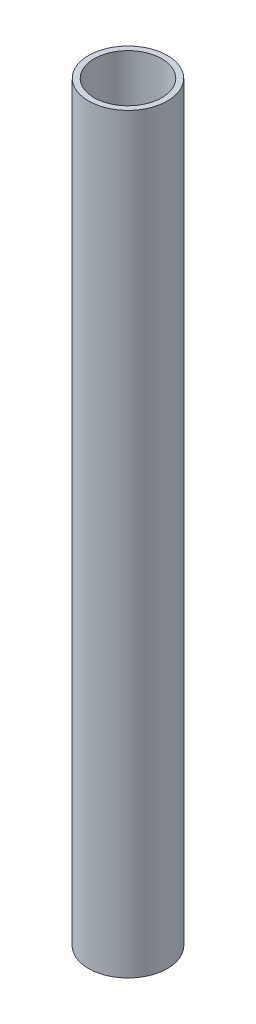
ISO-10303-21;
HEADER;
FILE_DESCRIPTION(('STEP AP214'),'2;1');
FILE_NAME('part.step','',(''),(''),'','','');
FILE_SCHEMA(('AUTOMOTIVE_DESIGN { 1 0 10303 214 1 1 1 1 }'));
ENDSEC;
DATA;
#1=APPLICATION_CONTEXT('core data for automotive mechanical design processes');
#2=APPLICATION_PROTOCOL_DEFINITION('international standard','automotive_design',2000,#1);
#3=PRODUCT_CONTEXT('',#1,'mechanical');
#4=PRODUCT('Part','Part','',(#3));
#5=PRODUCT_RELATED_PRODUCT_CATEGORY('part','',(#4));
#6=PRODUCT_DEFINITION_FORMATION('','',#4);
#7=PRODUCT_DEFINITION_CONTEXT('part definition',#1,'design');
#8=PRODUCT_DEFINITION('design','',#6,#7);
#9=PRODUCT_DEFINITION_SHAPE('','',#8);
#10=(LENGTH_UNIT() NAMED_UNIT(*) SI_UNIT(.MILLI.,.METRE.));
#11=(NAMED_UNIT(*) PLANE_ANGLE_UNIT() SI_UNIT($,.RADIAN.));
#12=(NAMED_UNIT(*) SI_UNIT($,.STERADIAN.) SOLID_ANGLE_UNIT());
#13=UNCERTAINTY_MEASURE_WITH_UNIT(LENGTH_MEASURE(1.E-05),#10,'distance_accuracy_value','');
#14=(GEOMETRIC_REPRESENTATION_CONTEXT(3) GLOBAL_UNCERTAINTY_ASSIGNED_CONTEXT((#13)) GLOBAL_UNIT_ASSIGNED_CONTEXT((#10,
#11,#12)) REPRESENTATION_CONTEXT('',''));
#15=CARTESIAN_POINT('',(0.,0.,0.));
#16=DIRECTION('',(0.,0.,1.));
#17=DIRECTION('',(1.,0.,0.));
#18=AXIS2_PLACEMENT_3D('',#15,#16,#17);
#19=CARTESIAN_POINT('',(0.,50.,0.));
#20=DIRECTION('',(0.,-1.,0.));
#21=DIRECTION('',(0.,0.,-1.));
#22=AXIS2_PLACEMENT_3D('',#19,#20,#21);
#23=CYLINDRICAL_SURFACE('',#22,5.25);
#24=CARTESIAN_POINT('',(0.,50.,0.));
#25=DIRECTION('',(0.,1.,0.));
#26=DIRECTION('',(0.,0.,1.));
#27=AXIS2_PLACEMENT_3D('',#24,#25,#26);
#28=CIRCLE('',#27,5.25);
#29=CARTESIAN_POINT('',(0.,50.,5.25));
#30=VERTEX_POINT('',#29);
#31=EDGE_CURVE('E10',#30,#30,#28,.T.);
#32=ORIENTED_EDGE('',*,*,#31,.F.);
#33=EDGE_LOOP('',(#32));
#34=FACE_BOUND('',#33,.T.);
#35=CARTESIAN_POINT('',(0.,-50.,0.));
#36=DIRECTION('',(0.,1.,0.));
#37=DIRECTION('',(0.,0.,1.));
#38=AXIS2_PLACEMENT_3D('',#35,#36,#37);
#39=CIRCLE('',#38,5.25);
#40=CARTESIAN_POINT('',(0.,-50.,5.25));
#41=VERTEX_POINT('',#40);
#42=EDGE_CURVE('E39',#41,#41,#39,.T.);
#43=ORIENTED_EDGE('',*,*,#42,.T.);
#44=EDGE_LOOP('',(#43));
#45=FACE_BOUND('',#44,.T.);
#46=ADVANCED_FACE('F36',(#34,#45),#23,.T.);
#47=CARTESIAN_POINT('',(0.,50.,0.));
#48=DIRECTION('',(0.,1.,0.));
#49=DIRECTION('',(0.,0.,1.));
#50=AXIS2_PLACEMENT_3D('',#47,#48,#49);
#51=PLANE('',#50);
#52=CARTESIAN_POINT('',(0.,50.,0.));
#53=DIRECTION('',(0.,1.,0.));
#54=DIRECTION('',(0.,0.,1.));
#55=AXIS2_PLACEMENT_3D('',#52,#53,#54);
#56=CIRCLE('',#55,4.49999999999999);
#57=CARTESIAN_POINT('',(0.,50.,4.49999999999999));
#58=VERTEX_POINT('',#57);
#59=EDGE_CURVE('E50',#58,#58,#56,.T.);
#60=ORIENTED_EDGE('',*,*,#59,.F.);
#61=EDGE_LOOP('',(#60));
#62=FACE_BOUND('',#61,.T.);
#63=ORIENTED_EDGE('',*,*,#31,.T.);
#64=EDGE_LOOP('',(#63));
#65=FACE_BOUND('',#64,.T.);
#66=ADVANCED_FACE('F56',(#62,#65),#51,.T.);
#67=CARTESIAN_POINT('',(0.,-50.,0.));
#68=DIRECTION('',(0.,1.,0.));
#69=DIRECTION('',(0.,0.,1.));
#70=AXIS2_PLACEMENT_3D('',#67,#68,#69);
#71=PLANE('',#70);
#72=CARTESIAN_POINT('',(0.,-50.,0.));
#73=DIRECTION('',(0.,1.,0.));
#74=DIRECTION('',(0.,0.,1.));
#75=AXIS2_PLACEMENT_3D('',#72,#73,#74);
#76=CIRCLE('',#75,4.49999999999998);
#77=CARTESIAN_POINT('',(0.,-50.,4.49999999999998));
#78=VERTEX_POINT('',#77);
#79=EDGE_CURVE('E46',#78,#78,#76,.T.);
#80=ORIENTED_EDGE('',*,*,#79,.T.);
#81=EDGE_LOOP('',(#80));
#82=FACE_BOUND('',#81,.T.);
#83=ORIENTED_EDGE('',*,*,#42,.F.);
#84=EDGE_LOOP('',(#83));
#85=FACE_BOUND('',#84,.T.);
#86=ADVANCED_FACE('F58',(#82,#85),#71,.F.);
#87=CARTESIAN_POINT('',(0.,50.,0.));
#88=DIRECTION('',(0.,1.,0.));
#89=DIRECTION('',(0.,0.,1.));
#90=AXIS2_PLACEMENT_3D('',#87,#88,#89);
#91=CYLINDRICAL_SURFACE('',#90,4.49999999999998);
#92=ORIENTED_EDGE('',*,*,#79,.F.);
#93=EDGE_LOOP('',(#92));
#94=FACE_BOUND('',#93,.T.);
#95=ORIENTED_EDGE('',*,*,#59,.T.);
#96=EDGE_LOOP('',(#95));
#97=FACE_BOUND('',#96,.T.);
#98=ADVANCED_FACE('F54',(#94,#97),#91,.F.);
#99=CLOSED_SHELL('',(#46,#66,#86,#98));
#100=MANIFOLD_SOLID_BREP('B2',#99);
#101=ADVANCED_BREP_SHAPE_REPRESENTATION('',(#18,#100),#14);
#102=SHAPE_DEFINITION_REPRESENTATION(#9,#101);
ENDSEC;
END-ISO-10303-21;
